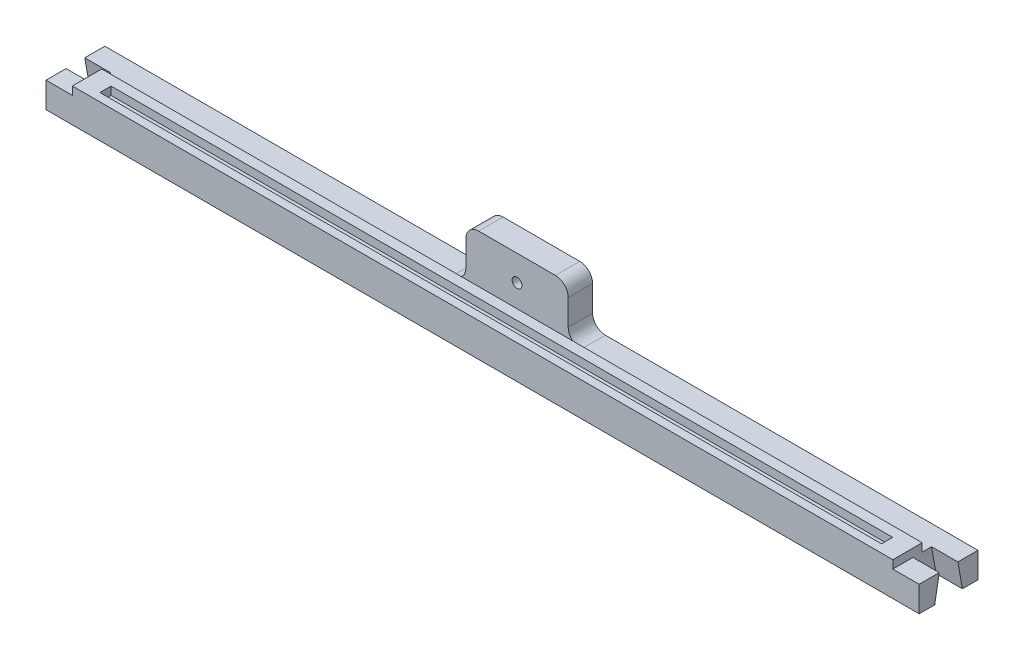
ISO-10303-21;
HEADER;
FILE_DESCRIPTION(('STEP AP214'),'2;1');
FILE_NAME('part.step','',(''),(''),'','','');
FILE_SCHEMA(('AUTOMOTIVE_DESIGN { 1 0 10303 214 1 1 1 1 }'));
ENDSEC;
DATA;
#1=APPLICATION_CONTEXT('core data for automotive mechanical design processes');
#2=APPLICATION_PROTOCOL_DEFINITION('international standard','automotive_design',2000,#1);
#3=PRODUCT_CONTEXT('',#1,'mechanical');
#4=PRODUCT('Part','Part','',(#3));
#5=PRODUCT_RELATED_PRODUCT_CATEGORY('part','',(#4));
#6=PRODUCT_DEFINITION_FORMATION('','',#4);
#7=PRODUCT_DEFINITION_CONTEXT('part definition',#1,'design');
#8=PRODUCT_DEFINITION('design','',#6,#7);
#9=PRODUCT_DEFINITION_SHAPE('','',#8);
#10=(LENGTH_UNIT() NAMED_UNIT(*) SI_UNIT(.MILLI.,.METRE.));
#11=(NAMED_UNIT(*) PLANE_ANGLE_UNIT() SI_UNIT($,.RADIAN.));
#12=(NAMED_UNIT(*) SI_UNIT($,.STERADIAN.) SOLID_ANGLE_UNIT());
#13=UNCERTAINTY_MEASURE_WITH_UNIT(LENGTH_MEASURE(1.E-05),#10,'distance_accuracy_value','');
#14=(GEOMETRIC_REPRESENTATION_CONTEXT(3) GLOBAL_UNCERTAINTY_ASSIGNED_CONTEXT((#13)) GLOBAL_UNIT_ASSIGNED_CONTEXT((#10,
#11,#12)) REPRESENTATION_CONTEXT('',''));
#15=CARTESIAN_POINT('',(0.,0.,0.));
#16=DIRECTION('',(0.,0.,1.));
#17=DIRECTION('',(1.,0.,0.));
#18=AXIS2_PLACEMENT_3D('',#15,#16,#17);
#19=CARTESIAN_POINT('',(0.,20.,0.));
#20=DIRECTION('',(0.,1.,0.));
#21=DIRECTION('',(0.,0.,1.));
#22=AXIS2_PLACEMENT_3D('',#19,#20,#21);
#23=PLANE('',#22);
#24=DIRECTION('',(1.,0.,0.));
#25=VECTOR('',#24,1.);
#26=CARTESIAN_POINT('',(0.,20.,-3.95000000000002));
#27=LINE('',#26,#25);
#28=CARTESIAN_POINT('',(-50.,20.,-3.95000000000002));
#29=VERTEX_POINT('',#28);
#30=CARTESIAN_POINT('',(50.,20.,-3.95000000000002));
#31=VERTEX_POINT('',#30);
#32=EDGE_CURVE('E50',#29,#31,#27,.T.);
#33=ORIENTED_EDGE('',*,*,#32,.F.);
#34=DIRECTION('',(0.,0.,-1.));
#35=VECTOR('',#34,1.);
#36=CARTESIAN_POINT('',(-50.,20.,-23.));
#37=LINE('',#36,#35);
#38=CARTESIAN_POINT('',(-50.,20.,-23.));
#39=VERTEX_POINT('',#38);
#40=EDGE_CURVE('E345',#29,#39,#37,.T.);
#41=ORIENTED_EDGE('',*,*,#40,.T.);
#42=DIRECTION('',(1.,0.,0.));
#43=VECTOR('',#42,1.);
#44=CARTESIAN_POINT('',(0.,20.,-23.));
#45=LINE('',#44,#43);
#46=CARTESIAN_POINT('',(-341.35,20.,-23.));
#47=VERTEX_POINT('',#46);
#48=EDGE_CURVE('E367',#47,#39,#45,.T.);
#49=ORIENTED_EDGE('',*,*,#48,.F.);
#50=DIRECTION('',(0.,0.,1.));
#51=VECTOR('',#50,1.);
#52=CARTESIAN_POINT('',(-341.35,20.,0.));
#53=LINE('',#52,#51);
#54=CARTESIAN_POINT('',(-341.35,20.,-7.291));
#55=VERTEX_POINT('',#54);
#56=EDGE_CURVE('E436',#47,#55,#53,.T.);
#57=ORIENTED_EDGE('',*,*,#56,.T.);
#58=DIRECTION('',(-1.,0.,0.));
#59=VECTOR('',#58,1.);
#60=CARTESIAN_POINT('',(0.,20.,-7.29100000000004));
#61=LINE('',#60,#59);
#62=CARTESIAN_POINT('',(-320.75,20.,-7.291));
#63=VERTEX_POINT('',#62);
#64=EDGE_CURVE('E408',#63,#55,#61,.T.);
#65=ORIENTED_EDGE('',*,*,#64,.F.);
#66=DIRECTION('',(0.,0.,1.));
#67=VECTOR('',#66,1.);
#68=CARTESIAN_POINT('',(-320.75,20.,0.));
#69=LINE('',#68,#67);
#70=CARTESIAN_POINT('',(-320.75,20.,0.));
#71=VERTEX_POINT('',#70);
#72=EDGE_CURVE('E278',#63,#71,#69,.T.);
#73=ORIENTED_EDGE('',*,*,#72,.T.);
#74=DIRECTION('',(-1.,0.,0.));
#75=VECTOR('',#74,1.);
#76=CARTESIAN_POINT('',(0.,20.,0.));
#77=LINE('',#76,#75);
#78=CARTESIAN_POINT('',(320.75,20.,0.));
#79=VERTEX_POINT('',#78);
#80=EDGE_CURVE('E254',#79,#71,#77,.T.);
#81=ORIENTED_EDGE('',*,*,#80,.F.);
#82=DIRECTION('',(0.,0.,1.));
#83=VECTOR('',#82,1.);
#84=CARTESIAN_POINT('',(320.75,20.,0.));
#85=LINE('',#84,#83);
#86=CARTESIAN_POINT('',(320.75,20.,-7.29100000000008));
#87=VERTEX_POINT('',#86);
#88=EDGE_CURVE('E244',#87,#79,#85,.T.);
#89=ORIENTED_EDGE('',*,*,#88,.F.);
#90=DIRECTION('',(1.,0.,0.));
#91=VECTOR('',#90,1.);
#92=CARTESIAN_POINT('',(0.,20.,-7.29100000000005));
#93=LINE('',#92,#91);
#94=CARTESIAN_POINT('',(341.35,20.,-7.29100000000008));
#95=VERTEX_POINT('',#94);
#96=EDGE_CURVE('E474',#87,#95,#93,.T.);
#97=ORIENTED_EDGE('',*,*,#96,.T.);
#98=DIRECTION('',(0.,0.,1.));
#99=VECTOR('',#98,1.);
#100=CARTESIAN_POINT('',(341.35,20.,0.));
#101=LINE('',#100,#99);
#102=CARTESIAN_POINT('',(341.35,20.,-23.));
#103=VERTEX_POINT('',#102);
#104=EDGE_CURVE('E366',#103,#95,#101,.T.);
#105=ORIENTED_EDGE('',*,*,#104,.F.);
#106=CARTESIAN_POINT('',(50.,20.,-23.));
#107=VERTEX_POINT('',#106);
#108=EDGE_CURVE('E355',#107,#103,#45,.T.);
#109=ORIENTED_EDGE('',*,*,#108,.F.);
#110=DIRECTION('',(0.,0.,-1.));
#111=VECTOR('',#110,1.);
#112=CARTESIAN_POINT('',(50.,20.,0.));
#113=LINE('',#112,#111);
#114=EDGE_CURVE('E343',#107,#31,#113,.F.);
#115=ORIENTED_EDGE('',*,*,#114,.T.);
#116=EDGE_LOOP('',(#33,#41,#49,#57,#65,#73,#81,#89,#97,#105,#109,#115));
#117=FACE_BOUND('',#116,.T.);
#118=ADVANCED_FACE('F35',(#117),#23,.T.);
#119=DIRECTION('',(1.,0.,0.));
#120=VECTOR('',#119,1.);
#121=CARTESIAN_POINT('',(0.,20.,23.));
#122=LINE('',#121,#120);
#123=CARTESIAN_POINT('',(-341.35,20.,23.));
#124=VERTEX_POINT('',#123);
#125=CARTESIAN_POINT('',(-320.75,20.,23.));
#126=VERTEX_POINT('',#125);
#127=EDGE_CURVE('E463',#124,#126,#122,.T.);
#128=ORIENTED_EDGE('',*,*,#127,.T.);
#129=DIRECTION('',(0.,0.,-1.));
#130=VECTOR('',#129,1.);
#131=CARTESIAN_POINT('',(-320.75,20.,0.));
#132=LINE('',#131,#130);
#133=CARTESIAN_POINT('',(-320.75,20.,7.291));
#134=VERTEX_POINT('',#133);
#135=EDGE_CURVE('E404',#126,#134,#132,.T.);
#136=ORIENTED_EDGE('',*,*,#135,.T.);
#137=DIRECTION('',(-1.,0.,0.));
#138=VECTOR('',#137,1.);
#139=CARTESIAN_POINT('',(0.,20.,7.29099999999996));
#140=LINE('',#139,#138);
#141=CARTESIAN_POINT('',(-341.35,20.,7.291));
#142=VERTEX_POINT('',#141);
#143=EDGE_CURVE('E274',#134,#142,#140,.T.);
#144=ORIENTED_EDGE('',*,*,#143,.T.);
#145=DIRECTION('',(0.,0.,1.));
#146=VECTOR('',#145,1.);
#147=CARTESIAN_POINT('',(-341.35,20.,0.));
#148=LINE('',#147,#146);
#149=EDGE_CURVE('E277',#142,#124,#148,.T.);
#150=ORIENTED_EDGE('',*,*,#149,.T.);
#151=EDGE_LOOP('',(#128,#136,#144,#150));
#152=FACE_BOUND('',#151,.T.);
#153=ADVANCED_FACE('F514',(#152),#23,.T.);
#154=DIRECTION('',(0.,0.,-1.));
#155=VECTOR('',#154,1.);
#156=CARTESIAN_POINT('',(320.75,20.,0.));
#157=LINE('',#156,#155);
#158=CARTESIAN_POINT('',(320.75,20.,23.));
#159=VERTEX_POINT('',#158);
#160=CARTESIAN_POINT('',(320.75,20.,7.29099999999992));
#161=VERTEX_POINT('',#160);
#162=EDGE_CURVE('E377',#159,#161,#157,.T.);
#163=ORIENTED_EDGE('',*,*,#162,.F.);
#164=CARTESIAN_POINT('',(341.35,20.,23.));
#165=VERTEX_POINT('',#164);
#166=EDGE_CURVE('E468',#159,#165,#122,.T.);
#167=ORIENTED_EDGE('',*,*,#166,.T.);
#168=DIRECTION('',(0.,0.,1.));
#169=VECTOR('',#168,1.);
#170=CARTESIAN_POINT('',(341.35,20.,0.));
#171=LINE('',#170,#169);
#172=CARTESIAN_POINT('',(341.35,20.,7.29099999999992));
#173=VERTEX_POINT('',#172);
#174=EDGE_CURVE('E262',#173,#165,#171,.T.);
#175=ORIENTED_EDGE('',*,*,#174,.F.);
#176=DIRECTION('',(1.,0.,0.));
#177=VECTOR('',#176,1.);
#178=CARTESIAN_POINT('',(0.,20.,7.29099999999995));
#179=LINE('',#178,#177);
#180=EDGE_CURVE('E259',#161,#173,#179,.T.);
#181=ORIENTED_EDGE('',*,*,#180,.F.);
#182=EDGE_LOOP('',(#163,#167,#175,#181));
#183=FACE_BOUND('',#182,.T.);
#184=ADVANCED_FACE('F520',(#183),#23,.T.);
#185=CARTESIAN_POINT('',(-320.75,20.,0.));
#186=DIRECTION('',(1.,0.,0.));
#187=DIRECTION('',(0.,0.,-1.));
#188=AXIS2_PLACEMENT_3D('',#185,#186,#187);
#189=PLANE('',#188);
#190=DIRECTION('',(0.,0.,1.));
#191=VECTOR('',#190,1.);
#192=CARTESIAN_POINT('',(-320.75,0.,0.));
#193=LINE('',#192,#191);
#194=CARTESIAN_POINT('',(-320.75,0.,-10.8175396141693));
#195=VERTEX_POINT('',#194);
#196=CARTESIAN_POINT('',(-320.75,0.,10.8175396141693));
#197=VERTEX_POINT('',#196);
#198=EDGE_CURVE('E427',#195,#197,#193,.T.);
#199=ORIENTED_EDGE('',*,*,#198,.T.);
#200=DIRECTION('',(0.,-0.984807753012209,0.173648177666928));
#201=VECTOR('',#200,1.);
#202=CARTESIAN_POINT('',(-320.75,21.2468344324937,7.07114944907511));
#203=LINE('',#202,#201);
#204=EDGE_CURVE('E311',#197,#134,#203,.F.);
#205=ORIENTED_EDGE('',*,*,#204,.T.);
#206=ORIENTED_EDGE('',*,*,#135,.F.);
#207=DIRECTION('',(0.,-1.,0.));
#208=VECTOR('',#207,1.);
#209=CARTESIAN_POINT('',(-320.75,26.35,23.));
#210=LINE('',#209,#208);
#211=CARTESIAN_POINT('',(-320.75,26.35,23.));
#212=VERTEX_POINT('',#211);
#213=EDGE_CURVE('E250',#212,#126,#210,.T.);
#214=ORIENTED_EDGE('',*,*,#213,.F.);
#215=DIRECTION('',(0.,0.,-1.));
#216=VECTOR('',#215,1.);
#217=CARTESIAN_POINT('',(-320.75,26.35,0.));
#218=LINE('',#217,#216);
#219=CARTESIAN_POINT('',(-320.75,26.35,0.));
#220=VERTEX_POINT('',#219);
#221=EDGE_CURVE('E228',#212,#220,#218,.T.);
#222=ORIENTED_EDGE('',*,*,#221,.T.);
#223=DIRECTION('',(0.,-1.,0.));
#224=VECTOR('',#223,1.);
#225=CARTESIAN_POINT('',(-320.75,26.35,0.));
#226=LINE('',#225,#224);
#227=EDGE_CURVE('E224',#220,#71,#226,.T.);
#228=ORIENTED_EDGE('',*,*,#227,.T.);
#229=ORIENTED_EDGE('',*,*,#72,.F.);
#230=DIRECTION('',(0.,-0.984807753012209,-0.173648177666928));
#231=VECTOR('',#230,1.);
#232=CARTESIAN_POINT('',(-320.75,21.2468344324937,-7.07114944907511));
#233=LINE('',#232,#231);
#234=EDGE_CURVE('E315',#63,#195,#233,.T.);
#235=ORIENTED_EDGE('',*,*,#234,.T.);
#236=EDGE_LOOP('',(#199,#205,#206,#214,#222,#228,#229,#235));
#237=FACE_BOUND('',#236,.T.);
#238=ADVANCED_FACE('F489',(#237),#189,.F.);
#239=CARTESIAN_POINT('',(-341.35,20.,0.));
#240=DIRECTION('',(1.,0.,0.));
#241=DIRECTION('',(0.,0.,-1.));
#242=AXIS2_PLACEMENT_3D('',#239,#240,#241);
#243=PLANE('',#242);
#244=ORIENTED_EDGE('',*,*,#149,.F.);
#245=DIRECTION('',(0.,0.984807753012209,-0.173648177666928));
#246=VECTOR('',#245,1.);
#247=CARTESIAN_POINT('',(-341.35,20.0000000000005,7.291));
#248=LINE('',#247,#246);
#249=CARTESIAN_POINT('',(-341.35,0.,10.8175396141693));
#250=VERTEX_POINT('',#249);
#251=EDGE_CURVE('E302',#142,#250,#248,.F.);
#252=ORIENTED_EDGE('',*,*,#251,.T.);
#253=DIRECTION('',(0.,0.,1.));
#254=VECTOR('',#253,1.);
#255=CARTESIAN_POINT('',(-341.35,0.,0.));
#256=LINE('',#255,#254);
#257=CARTESIAN_POINT('',(-341.35,0.,23.));
#258=VERTEX_POINT('',#257);
#259=EDGE_CURVE('E430',#250,#258,#256,.T.);
#260=ORIENTED_EDGE('',*,*,#259,.T.);
#261=DIRECTION('',(0.,-1.,0.));
#262=VECTOR('',#261,1.);
#263=CARTESIAN_POINT('',(-341.35,20.,23.));
#264=LINE('',#263,#262);
#265=EDGE_CURVE('E288',#124,#258,#264,.T.);
#266=ORIENTED_EDGE('',*,*,#265,.F.);
#267=EDGE_LOOP('',(#244,#252,#260,#266));
#268=FACE_BOUND('',#267,.T.);
#269=ADVANCED_FACE('F538',(#268),#243,.F.);
#270=CARTESIAN_POINT('',(0.,20.,23.));
#271=DIRECTION('',(0.,0.,-1.));
#272=DIRECTION('',(-1.,0.,0.));
#273=AXIS2_PLACEMENT_3D('',#270,#271,#272);
#274=PLANE('',#273);
#275=DIRECTION('',(1.,0.,0.));
#276=VECTOR('',#275,1.);
#277=CARTESIAN_POINT('',(0.,0.,23.));
#278=LINE('',#277,#276);
#279=CARTESIAN_POINT('',(341.35,0.,23.));
#280=VERTEX_POINT('',#279);
#281=EDGE_CURVE('E433',#258,#280,#278,.T.);
#282=ORIENTED_EDGE('',*,*,#281,.T.);
#283=DIRECTION('',(0.,-1.,0.));
#284=VECTOR('',#283,1.);
#285=CARTESIAN_POINT('',(341.35,20.,23.));
#286=LINE('',#285,#284);
#287=EDGE_CURVE('E457',#165,#280,#286,.T.);
#288=ORIENTED_EDGE('',*,*,#287,.F.);
#289=ORIENTED_EDGE('',*,*,#166,.F.);
#290=DIRECTION('',(0.,-1.,0.));
#291=VECTOR('',#290,1.);
#292=CARTESIAN_POINT('',(320.75,26.35,23.));
#293=LINE('',#292,#291);
#294=CARTESIAN_POINT('',(320.75,26.35,23.));
#295=VERTEX_POINT('',#294);
#296=EDGE_CURVE('E265',#295,#159,#293,.T.);
#297=ORIENTED_EDGE('',*,*,#296,.F.);
#298=DIRECTION('',(1.,0.,0.));
#299=VECTOR('',#298,1.);
#300=CARTESIAN_POINT('',(0.,26.35,23.));
#301=LINE('',#300,#299);
#302=EDGE_CURVE('E235',#212,#295,#301,.T.);
#303=ORIENTED_EDGE('',*,*,#302,.F.);
#304=ORIENTED_EDGE('',*,*,#213,.T.);
#305=ORIENTED_EDGE('',*,*,#127,.F.);
#306=ORIENTED_EDGE('',*,*,#265,.T.);
#307=EDGE_LOOP('',(#282,#288,#289,#297,#303,#304,#305,#306));
#308=FACE_BOUND('',#307,.T.);
#309=ADVANCED_FACE('F545',(#308),#274,.F.);
#310=CARTESIAN_POINT('',(341.35,20.,0.));
#311=DIRECTION('',(1.,0.,0.));
#312=DIRECTION('',(0.,0.,-1.));
#313=AXIS2_PLACEMENT_3D('',#310,#311,#312);
#314=PLANE('',#313);
#315=DIRECTION('',(0.,0.,1.));
#316=VECTOR('',#315,1.);
#317=CARTESIAN_POINT('',(341.35,0.,0.));
#318=LINE('',#317,#316);
#319=CARTESIAN_POINT('',(341.35,0.,10.8175396141692));
#320=VERTEX_POINT('',#319);
#321=EDGE_CURVE('E440',#320,#280,#318,.T.);
#322=ORIENTED_EDGE('',*,*,#321,.F.);
#323=DIRECTION('',(0.,0.984807753012209,-0.173648177666928));
#324=VECTOR('',#323,1.);
#325=CARTESIAN_POINT('',(341.35,21.2468344324937,7.07114944907504));
#326=LINE('',#325,#324);
#327=EDGE_CURVE('E300',#320,#173,#326,.T.);
#328=ORIENTED_EDGE('',*,*,#327,.T.);
#329=ORIENTED_EDGE('',*,*,#174,.T.);
#330=ORIENTED_EDGE('',*,*,#287,.T.);
#331=EDGE_LOOP('',(#322,#328,#329,#330));
#332=FACE_BOUND('',#331,.T.);
#333=ADVANCED_FACE('F550',(#332),#314,.T.);
#334=CARTESIAN_POINT('',(320.75,20.,0.));
#335=DIRECTION('',(1.,0.,0.));
#336=DIRECTION('',(0.,0.,-1.));
#337=AXIS2_PLACEMENT_3D('',#334,#335,#336);
#338=PLANE('',#337);
#339=DIRECTION('',(0.,0.,1.));
#340=VECTOR('',#339,1.);
#341=CARTESIAN_POINT('',(320.75,0.,0.));
#342=LINE('',#341,#340);
#343=CARTESIAN_POINT('',(320.75,0.,-10.8175396141694));
#344=VERTEX_POINT('',#343);
#345=CARTESIAN_POINT('',(320.75,0.,10.8175396141692));
#346=VERTEX_POINT('',#345);
#347=EDGE_CURVE('E442',#344,#346,#342,.T.);
#348=ORIENTED_EDGE('',*,*,#347,.F.);
#349=DIRECTION('',(0.,-0.984807753012209,-0.173648177666928));
#350=VECTOR('',#349,1.);
#351=CARTESIAN_POINT('',(320.75,20.0000000000005,-7.29100000000008));
#352=LINE('',#351,#350);
#353=EDGE_CURVE('E306',#344,#87,#352,.F.);
#354=ORIENTED_EDGE('',*,*,#353,.T.);
#355=ORIENTED_EDGE('',*,*,#88,.T.);
#356=DIRECTION('',(0.,-1.,0.));
#357=VECTOR('',#356,1.);
#358=CARTESIAN_POINT('',(320.75,26.35,0.));
#359=LINE('',#358,#357);
#360=CARTESIAN_POINT('',(320.75,26.35,0.));
#361=VERTEX_POINT('',#360);
#362=EDGE_CURVE('E222',#361,#79,#359,.T.);
#363=ORIENTED_EDGE('',*,*,#362,.F.);
#364=DIRECTION('',(0.,0.,-1.));
#365=VECTOR('',#364,1.);
#366=CARTESIAN_POINT('',(320.75,26.35,0.));
#367=LINE('',#366,#365);
#368=EDGE_CURVE('E229',#295,#361,#367,.T.);
#369=ORIENTED_EDGE('',*,*,#368,.F.);
#370=ORIENTED_EDGE('',*,*,#296,.T.);
#371=ORIENTED_EDGE('',*,*,#162,.T.);
#372=DIRECTION('',(0.,-0.984807753012209,0.173648177666928));
#373=VECTOR('',#372,1.);
#374=CARTESIAN_POINT('',(320.75,0.,10.8175396141692));
#375=LINE('',#374,#373);
#376=EDGE_CURVE('E308',#161,#346,#375,.T.);
#377=ORIENTED_EDGE('',*,*,#376,.T.);
#378=EDGE_LOOP('',(#348,#354,#355,#363,#369,#370,#371,#377));
#379=FACE_BOUND('',#378,.T.);
#380=ADVANCED_FACE('F242',(#379),#338,.T.);
#381=CARTESIAN_POINT('',(341.35,20.,0.));
#382=DIRECTION('',(1.,0.,0.));
#383=DIRECTION('',(0.,0.,-1.));
#384=AXIS2_PLACEMENT_3D('',#381,#382,#383);
#385=PLANE('',#384);
#386=ORIENTED_EDGE('',*,*,#104,.T.);
#387=DIRECTION('',(0.,0.984807753012209,0.173648177666928));
#388=VECTOR('',#387,1.);
#389=CARTESIAN_POINT('',(341.35,21.2468344324937,-7.07114944907519));
#390=LINE('',#389,#388);
#391=CARTESIAN_POINT('',(341.35,0.,-10.8175396141694));
#392=VERTEX_POINT('',#391);
#393=EDGE_CURVE('E285',#95,#392,#390,.F.);
#394=ORIENTED_EDGE('',*,*,#393,.T.);
#395=DIRECTION('',(0.,0.,1.));
#396=VECTOR('',#395,1.);
#397=CARTESIAN_POINT('',(341.35,0.,0.));
#398=LINE('',#397,#396);
#399=CARTESIAN_POINT('',(341.35,0.,-23.));
#400=VERTEX_POINT('',#399);
#401=EDGE_CURVE('E444',#400,#392,#398,.T.);
#402=ORIENTED_EDGE('',*,*,#401,.F.);
#403=DIRECTION('',(0.,-1.,0.));
#404=VECTOR('',#403,1.);
#405=CARTESIAN_POINT('',(341.35,20.,-23.));
#406=LINE('',#405,#404);
#407=EDGE_CURVE('E455',#103,#400,#406,.T.);
#408=ORIENTED_EDGE('',*,*,#407,.F.);
#409=EDGE_LOOP('',(#386,#394,#402,#408));
#410=FACE_BOUND('',#409,.T.);
#411=ADVANCED_FACE('F497',(#410),#385,.T.);
#412=CARTESIAN_POINT('',(0.,20.,-23.));
#413=DIRECTION('',(0.,0.,-1.));
#414=DIRECTION('',(-1.,0.,0.));
#415=AXIS2_PLACEMENT_3D('',#412,#413,#414);
#416=PLANE('',#415);
#417=CARTESIAN_POINT('',(0.,40.,-23.));
#418=DIRECTION('',(0.,0.,-1.));
#419=DIRECTION('',(-1.,0.,0.));
#420=AXIS2_PLACEMENT_3D('',#417,#418,#419);
#421=CIRCLE('',#420,3.81);
#422=CARTESIAN_POINT('',(-3.81000000000001,40.,-23.));
#423=VERTEX_POINT('',#422);
#424=EDGE_CURVE('E284',#423,#423,#421,.T.);
#425=ORIENTED_EDGE('',*,*,#424,.F.);
#426=EDGE_LOOP('',(#425));
#427=FACE_BOUND('',#426,.T.);
#428=DIRECTION('',(-1.,0.,0.));
#429=VECTOR('',#428,1.);
#430=CARTESIAN_POINT('',(0.,60.,-23.));
#431=LINE('',#430,#429);
#432=CARTESIAN_POINT('',(30.,60.,-23.));
#433=VERTEX_POINT('',#432);
#434=CARTESIAN_POINT('',(-30.,60.,-23.));
#435=VERTEX_POINT('',#434);
#436=EDGE_CURVE('E600',#433,#435,#431,.T.);
#437=ORIENTED_EDGE('',*,*,#436,.F.);
#438=CARTESIAN_POINT('',(30.,50.,-23.));
#439=DIRECTION('',(0.,0.,-1.));
#440=DIRECTION('',(-1.,0.,0.));
#441=AXIS2_PLACEMENT_3D('',#438,#439,#440);
#442=CIRCLE('',#441,10.);
#443=CARTESIAN_POINT('',(40.,50.,-23.));
#444=VERTEX_POINT('',#443);
#445=EDGE_CURVE('E327',#433,#444,#442,.T.);
#446=ORIENTED_EDGE('',*,*,#445,.T.);
#447=DIRECTION('',(0.,-1.,0.));
#448=VECTOR('',#447,1.);
#449=CARTESIAN_POINT('',(40.,60.,-23.));
#450=LINE('',#449,#448);
#451=CARTESIAN_POINT('',(40.,30.,-23.));
#452=VERTEX_POINT('',#451);
#453=EDGE_CURVE('E358',#444,#452,#450,.T.);
#454=ORIENTED_EDGE('',*,*,#453,.T.);
#455=CARTESIAN_POINT('',(50.,30.,-23.));
#456=DIRECTION('',(0.,0.,-1.));
#457=DIRECTION('',(-1.,0.,0.));
#458=AXIS2_PLACEMENT_3D('',#455,#456,#457);
#459=CIRCLE('',#458,10.);
#460=EDGE_CURVE('E43',#452,#107,#459,.F.);
#461=ORIENTED_EDGE('',*,*,#460,.T.);
#462=ORIENTED_EDGE('',*,*,#108,.T.);
#463=ORIENTED_EDGE('',*,*,#407,.T.);
#464=DIRECTION('',(1.,0.,0.));
#465=VECTOR('',#464,1.);
#466=CARTESIAN_POINT('',(0.,0.,-23.));
#467=LINE('',#466,#465);
#468=CARTESIAN_POINT('',(-341.35,0.,-23.));
#469=VERTEX_POINT('',#468);
#470=EDGE_CURVE('E447',#469,#400,#467,.T.);
#471=ORIENTED_EDGE('',*,*,#470,.F.);
#472=DIRECTION('',(0.,-1.,0.));
#473=VECTOR('',#472,1.);
#474=CARTESIAN_POINT('',(-341.35,20.,-23.));
#475=LINE('',#474,#473);
#476=EDGE_CURVE('E453',#47,#469,#475,.T.);
#477=ORIENTED_EDGE('',*,*,#476,.F.);
#478=ORIENTED_EDGE('',*,*,#48,.T.);
#479=CARTESIAN_POINT('',(-50.,30.,-23.));
#480=DIRECTION('',(0.,0.,-1.));
#481=DIRECTION('',(-1.,0.,0.));
#482=AXIS2_PLACEMENT_3D('',#479,#480,#481);
#483=CIRCLE('',#482,10.);
#484=CARTESIAN_POINT('',(-40.,30.,-23.));
#485=VERTEX_POINT('',#484);
#486=EDGE_CURVE('E347',#39,#485,#483,.F.);
#487=ORIENTED_EDGE('',*,*,#486,.T.);
#488=DIRECTION('',(0.,-1.,0.));
#489=VECTOR('',#488,1.);
#490=CARTESIAN_POINT('',(-40.,60.,-23.));
#491=LINE('',#490,#489);
#492=CARTESIAN_POINT('',(-40.,50.,-23.));
#493=VERTEX_POINT('',#492);
#494=EDGE_CURVE('E381',#493,#485,#491,.T.);
#495=ORIENTED_EDGE('',*,*,#494,.F.);
#496=CARTESIAN_POINT('',(-30.,50.,-23.));
#497=DIRECTION('',(0.,0.,-1.));
#498=DIRECTION('',(-1.,0.,0.));
#499=AXIS2_PLACEMENT_3D('',#496,#497,#498);
#500=CIRCLE('',#499,10.);
#501=EDGE_CURVE('E325',#493,#435,#500,.T.);
#502=ORIENTED_EDGE('',*,*,#501,.T.);
#503=EDGE_LOOP('',(#437,#446,#454,#461,#462,#463,#471,#477,#478,#487,#495,#502));
#504=FACE_BOUND('',#503,.T.);
#505=ADVANCED_FACE('F354',(#427,#504),#416,.T.);
#506=CARTESIAN_POINT('',(-341.35,20.,0.));
#507=DIRECTION('',(1.,0.,0.));
#508=DIRECTION('',(0.,0.,-1.));
#509=AXIS2_PLACEMENT_3D('',#506,#507,#508);
#510=PLANE('',#509);
#511=DIRECTION('',(0.,0.,1.));
#512=VECTOR('',#511,1.);
#513=CARTESIAN_POINT('',(-341.35,0.,0.));
#514=LINE('',#513,#512);
#515=CARTESIAN_POINT('',(-341.35,0.,-10.8175396141693));
#516=VERTEX_POINT('',#515);
#517=EDGE_CURVE('E450',#469,#516,#514,.T.);
#518=ORIENTED_EDGE('',*,*,#517,.T.);
#519=DIRECTION('',(0.,0.984807753012209,0.173648177666928));
#520=VECTOR('',#519,1.);
#521=CARTESIAN_POINT('',(-341.35,0.,-10.8175396141693));
#522=LINE('',#521,#520);
#523=EDGE_CURVE('E304',#516,#55,#522,.T.);
#524=ORIENTED_EDGE('',*,*,#523,.T.);
#525=ORIENTED_EDGE('',*,*,#56,.F.);
#526=ORIENTED_EDGE('',*,*,#476,.T.);
#527=EDGE_LOOP('',(#518,#524,#525,#526));
#528=FACE_BOUND('',#527,.T.);
#529=ADVANCED_FACE('F502',(#528),#510,.F.);
#530=CARTESIAN_POINT('',(0.,0.,0.));
#531=DIRECTION('',(0.,1.,0.));
#532=DIRECTION('',(0.,0.,1.));
#533=AXIS2_PLACEMENT_3D('',#530,#531,#532);
#534=PLANE('',#533);
#535=ORIENTED_EDGE('',*,*,#401,.T.);
#536=DIRECTION('',(-1.,0.,0.));
#537=VECTOR('',#536,1.);
#538=CARTESIAN_POINT('',(0.,0.,-10.8175396141694));
#539=LINE('',#538,#537);
#540=EDGE_CURVE('E297',#392,#344,#539,.T.);
#541=ORIENTED_EDGE('',*,*,#540,.T.);
#542=ORIENTED_EDGE('',*,*,#347,.T.);
#543=DIRECTION('',(1.,0.,0.));
#544=VECTOR('',#543,1.);
#545=CARTESIAN_POINT('',(341.35,0.,10.8175396141692));
#546=LINE('',#545,#544);
#547=EDGE_CURVE('E294',#346,#320,#546,.T.);
#548=ORIENTED_EDGE('',*,*,#547,.T.);
#549=ORIENTED_EDGE('',*,*,#321,.T.);
#550=ORIENTED_EDGE('',*,*,#281,.F.);
#551=ORIENTED_EDGE('',*,*,#259,.F.);
#552=DIRECTION('',(1.,0.,0.));
#553=VECTOR('',#552,1.);
#554=CARTESIAN_POINT('',(0.,0.,10.8175396141693));
#555=LINE('',#554,#553);
#556=EDGE_CURVE('E291',#250,#197,#555,.T.);
#557=ORIENTED_EDGE('',*,*,#556,.T.);
#558=ORIENTED_EDGE('',*,*,#198,.F.);
#559=DIRECTION('',(-1.,0.,0.));
#560=VECTOR('',#559,1.);
#561=CARTESIAN_POINT('',(-341.35,0.,-10.8175396141693));
#562=LINE('',#561,#560);
#563=EDGE_CURVE('E287',#195,#516,#562,.T.);
#564=ORIENTED_EDGE('',*,*,#563,.T.);
#565=ORIENTED_EDGE('',*,*,#517,.F.);
#566=ORIENTED_EDGE('',*,*,#470,.T.);
#567=EDGE_LOOP('',(#535,#541,#542,#548,#549,#550,#551,#557,#558,#564,#565,#566));
#568=FACE_BOUND('',#567,.T.);
#569=ADVANCED_FACE('F499',(#568),#534,.F.);
#570=CARTESIAN_POINT('',(0.,26.35,7.91875));
#571=DIRECTION('',(0.,0.,-1.));
#572=DIRECTION('',(-1.,0.,0.));
#573=AXIS2_PLACEMENT_3D('',#570,#571,#572);
#574=PLANE('',#573);
#575=DIRECTION('',(1.,0.,0.));
#576=VECTOR('',#575,1.);
#577=CARTESIAN_POINT('',(0.,20.,7.91875));
#578=LINE('',#577,#576);
#579=CARTESIAN_POINT('',(-305.55,20.,7.91875));
#580=VERTEX_POINT('',#579);
#581=CARTESIAN_POINT('',(305.55,20.,7.91875));
#582=VERTEX_POINT('',#581);
#583=EDGE_CURVE('E407',#580,#582,#578,.T.);
#584=ORIENTED_EDGE('',*,*,#583,.T.);
#585=DIRECTION('',(0.,-1.,0.));
#586=VECTOR('',#585,1.);
#587=CARTESIAN_POINT('',(305.55,26.35,7.91875));
#588=LINE('',#587,#586);
#589=CARTESIAN_POINT('',(305.55,26.35,7.91875));
#590=VERTEX_POINT('',#589);
#591=EDGE_CURVE('E402',#590,#582,#588,.T.);
#592=ORIENTED_EDGE('',*,*,#591,.F.);
#593=DIRECTION('',(1.,0.,0.));
#594=VECTOR('',#593,1.);
#595=CARTESIAN_POINT('',(0.,26.35,7.91875));
#596=LINE('',#595,#594);
#597=CARTESIAN_POINT('',(-305.55,26.35,7.91875));
#598=VERTEX_POINT('',#597);
#599=EDGE_CURVE('E387',#598,#590,#596,.T.);
#600=ORIENTED_EDGE('',*,*,#599,.F.);
#601=DIRECTION('',(0.,-1.,0.));
#602=VECTOR('',#601,1.);
#603=CARTESIAN_POINT('',(-305.55,26.35,7.91875));
#604=LINE('',#603,#602);
#605=EDGE_CURVE('E245',#598,#580,#604,.T.);
#606=ORIENTED_EDGE('',*,*,#605,.T.);
#607=EDGE_LOOP('',(#584,#592,#600,#606));
#608=FACE_BOUND('',#607,.T.);
#609=ADVANCED_FACE('F509',(#608),#574,.F.);
#610=CARTESIAN_POINT('',(305.55,26.35,0.));
#611=DIRECTION('',(1.,0.,0.));
#612=DIRECTION('',(0.,0.,-1.));
#613=AXIS2_PLACEMENT_3D('',#610,#611,#612);
#614=PLANE('',#613);
#615=DIRECTION('',(0.,0.,1.));
#616=VECTOR('',#615,1.);
#617=CARTESIAN_POINT('',(305.55,20.,0.));
#618=LINE('',#617,#616);
#619=CARTESIAN_POINT('',(305.55,20.,16.65));
#620=VERTEX_POINT('',#619);
#621=EDGE_CURVE('E414',#582,#620,#618,.T.);
#622=ORIENTED_EDGE('',*,*,#621,.T.);
#623=DIRECTION('',(0.,-1.,0.));
#624=VECTOR('',#623,1.);
#625=CARTESIAN_POINT('',(305.55,26.35,16.65));
#626=LINE('',#625,#624);
#627=CARTESIAN_POINT('',(305.55,26.35,16.65));
#628=VERTEX_POINT('',#627);
#629=EDGE_CURVE('E421',#628,#620,#626,.T.);
#630=ORIENTED_EDGE('',*,*,#629,.F.);
#631=DIRECTION('',(0.,0.,1.));
#632=VECTOR('',#631,1.);
#633=CARTESIAN_POINT('',(305.55,26.35,0.));
#634=LINE('',#633,#632);
#635=EDGE_CURVE('E390',#590,#628,#634,.T.);
#636=ORIENTED_EDGE('',*,*,#635,.F.);
#637=ORIENTED_EDGE('',*,*,#591,.T.);
#638=EDGE_LOOP('',(#622,#630,#636,#637));
#639=FACE_BOUND('',#638,.T.);
#640=ADVANCED_FACE('F635',(#639),#614,.F.);
#641=CARTESIAN_POINT('',(0.,26.35,16.65));
#642=DIRECTION('',(0.,0.,-1.));
#643=DIRECTION('',(-1.,0.,0.));
#644=AXIS2_PLACEMENT_3D('',#641,#642,#643);
#645=PLANE('',#644);
#646=DIRECTION('',(1.,0.,0.));
#647=VECTOR('',#646,1.);
#648=CARTESIAN_POINT('',(0.,20.,16.65));
#649=LINE('',#648,#647);
#650=CARTESIAN_POINT('',(-305.55,20.,16.65));
#651=VERTEX_POINT('',#650);
#652=EDGE_CURVE('E417',#651,#620,#649,.T.);
#653=ORIENTED_EDGE('',*,*,#652,.F.);
#654=DIRECTION('',(0.,-1.,0.));
#655=VECTOR('',#654,1.);
#656=CARTESIAN_POINT('',(-305.55,26.35,16.65));
#657=LINE('',#656,#655);
#658=CARTESIAN_POINT('',(-305.55,26.35,16.65));
#659=VERTEX_POINT('',#658);
#660=EDGE_CURVE('E248',#659,#651,#657,.T.);
#661=ORIENTED_EDGE('',*,*,#660,.F.);
#662=DIRECTION('',(1.,0.,0.));
#663=VECTOR('',#662,1.);
#664=CARTESIAN_POINT('',(0.,26.35,16.65));
#665=LINE('',#664,#663);
#666=EDGE_CURVE('E392',#659,#628,#665,.T.);
#667=ORIENTED_EDGE('',*,*,#666,.T.);
#668=ORIENTED_EDGE('',*,*,#629,.T.);
#669=EDGE_LOOP('',(#653,#661,#667,#668));
#670=FACE_BOUND('',#669,.T.);
#671=ADVANCED_FACE('F632',(#670),#645,.T.);
#672=CARTESIAN_POINT('',(0.,26.35,0.));
#673=DIRECTION('',(0.,0.,1.));
#674=DIRECTION('',(1.,0.,0.));
#675=AXIS2_PLACEMENT_3D('',#672,#673,#674);
#676=PLANE('',#675);
#677=ORIENTED_EDGE('',*,*,#80,.T.);
#678=ORIENTED_EDGE('',*,*,#227,.F.);
#679=DIRECTION('',(-1.,0.,0.));
#680=VECTOR('',#679,1.);
#681=CARTESIAN_POINT('',(0.,26.35,0.));
#682=LINE('',#681,#680);
#683=EDGE_CURVE('E217',#361,#220,#682,.T.);
#684=ORIENTED_EDGE('',*,*,#683,.F.);
#685=ORIENTED_EDGE('',*,*,#362,.T.);
#686=EDGE_LOOP('',(#677,#678,#684,#685));
#687=FACE_BOUND('',#686,.T.);
#688=ADVANCED_FACE('F220',(#687),#676,.F.);
#689=CARTESIAN_POINT('',(-305.55,26.35,0.));
#690=DIRECTION('',(1.,0.,0.));
#691=DIRECTION('',(0.,0.,-1.));
#692=AXIS2_PLACEMENT_3D('',#689,#690,#691);
#693=PLANE('',#692);
#694=DIRECTION('',(0.,0.,1.));
#695=VECTOR('',#694,1.);
#696=CARTESIAN_POINT('',(-305.55,20.,0.));
#697=LINE('',#696,#695);
#698=EDGE_CURVE('E239',#580,#651,#697,.T.);
#699=ORIENTED_EDGE('',*,*,#698,.F.);
#700=ORIENTED_EDGE('',*,*,#605,.F.);
#701=DIRECTION('',(0.,0.,1.));
#702=VECTOR('',#701,1.);
#703=CARTESIAN_POINT('',(-305.55,26.35,0.));
#704=LINE('',#703,#702);
#705=EDGE_CURVE('E267',#598,#659,#704,.T.);
#706=ORIENTED_EDGE('',*,*,#705,.T.);
#707=ORIENTED_EDGE('',*,*,#660,.T.);
#708=EDGE_LOOP('',(#699,#700,#706,#707));
#709=FACE_BOUND('',#708,.T.);
#710=ADVANCED_FACE('F531',(#709),#693,.T.);
#711=CARTESIAN_POINT('',(0.,26.35,0.));
#712=DIRECTION('',(0.,1.,0.));
#713=DIRECTION('',(0.,0.,1.));
#714=AXIS2_PLACEMENT_3D('',#711,#712,#713);
#715=PLANE('',#714);
#716=ORIENTED_EDGE('',*,*,#368,.T.);
#717=ORIENTED_EDGE('',*,*,#683,.T.);
#718=ORIENTED_EDGE('',*,*,#221,.F.);
#719=ORIENTED_EDGE('',*,*,#302,.T.);
#720=EDGE_LOOP('',(#716,#717,#718,#719));
#721=FACE_BOUND('',#720,.T.);
#722=ORIENTED_EDGE('',*,*,#599,.T.);
#723=ORIENTED_EDGE('',*,*,#635,.T.);
#724=ORIENTED_EDGE('',*,*,#666,.F.);
#725=ORIENTED_EDGE('',*,*,#705,.F.);
#726=EDGE_LOOP('',(#722,#723,#724,#725));
#727=FACE_BOUND('',#726,.T.);
#728=ADVANCED_FACE('F232',(#721,#727),#715,.T.);
#729=ORIENTED_EDGE('',*,*,#583,.F.);
#730=ORIENTED_EDGE('',*,*,#698,.T.);
#731=ORIENTED_EDGE('',*,*,#652,.T.);
#732=ORIENTED_EDGE('',*,*,#621,.F.);
#733=EDGE_LOOP('',(#729,#730,#731,#732));
#734=FACE_BOUND('',#733,.T.);
#735=ADVANCED_FACE('F516',(#734),#23,.T.);
#736=CARTESIAN_POINT('',(0.,60.,-3.95000000000002));
#737=DIRECTION('',(0.,0.,-1.));
#738=DIRECTION('',(-1.,0.,0.));
#739=AXIS2_PLACEMENT_3D('',#736,#737,#738);
#740=PLANE('',#739);
#741=CARTESIAN_POINT('',(0.,40.,-3.95000000000002));
#742=DIRECTION('',(0.,0.,-1.));
#743=DIRECTION('',(-1.,0.,0.));
#744=AXIS2_PLACEMENT_3D('',#741,#742,#743);
#745=CIRCLE('',#744,3.81);
#746=CARTESIAN_POINT('',(-3.81000000000001,40.,-3.95000000000002));
#747=VERTEX_POINT('',#746);
#748=EDGE_CURVE('E281',#747,#747,#745,.T.);
#749=ORIENTED_EDGE('',*,*,#748,.T.);
#750=EDGE_LOOP('',(#749));
#751=FACE_BOUND('',#750,.T.);
#752=DIRECTION('',(0.,-1.,0.));
#753=VECTOR('',#752,1.);
#754=CARTESIAN_POINT('',(40.,60.,-3.95000000000002));
#755=LINE('',#754,#753);
#756=CARTESIAN_POINT('',(40.,50.,-3.95000000000002));
#757=VERTEX_POINT('',#756);
#758=CARTESIAN_POINT('',(40.,30.,-3.95000000000002));
#759=VERTEX_POINT('',#758);
#760=EDGE_CURVE('E372',#757,#759,#755,.T.);
#761=ORIENTED_EDGE('',*,*,#760,.F.);
#762=CARTESIAN_POINT('',(30.,50.,-3.95000000000002));
#763=DIRECTION('',(0.,0.,-1.));
#764=DIRECTION('',(-1.,0.,0.));
#765=AXIS2_PLACEMENT_3D('',#762,#763,#764);
#766=CIRCLE('',#765,10.);
#767=CARTESIAN_POINT('',(30.,60.,-3.95000000000002));
#768=VERTEX_POINT('',#767);
#769=EDGE_CURVE('E336',#757,#768,#766,.F.);
#770=ORIENTED_EDGE('',*,*,#769,.T.);
#771=DIRECTION('',(1.,0.,0.));
#772=VECTOR('',#771,1.);
#773=CARTESIAN_POINT('',(0.,60.,-3.95000000000002));
#774=LINE('',#773,#772);
#775=CARTESIAN_POINT('',(-30.,60.,-3.95000000000002));
#776=VERTEX_POINT('',#775);
#777=EDGE_CURVE('E604',#776,#768,#774,.T.);
#778=ORIENTED_EDGE('',*,*,#777,.F.);
#779=CARTESIAN_POINT('',(-30.,50.,-3.95000000000002));
#780=DIRECTION('',(0.,0.,-1.));
#781=DIRECTION('',(-1.,0.,0.));
#782=AXIS2_PLACEMENT_3D('',#779,#780,#781);
#783=CIRCLE('',#782,10.);
#784=CARTESIAN_POINT('',(-40.,50.,-3.95000000000002));
#785=VERTEX_POINT('',#784);
#786=EDGE_CURVE('E334',#776,#785,#783,.F.);
#787=ORIENTED_EDGE('',*,*,#786,.T.);
#788=DIRECTION('',(0.,-1.,0.));
#789=VECTOR('',#788,1.);
#790=CARTESIAN_POINT('',(-40.,60.,-3.95000000000002));
#791=LINE('',#790,#789);
#792=CARTESIAN_POINT('',(-40.,30.,-3.95000000000002));
#793=VERTEX_POINT('',#792);
#794=EDGE_CURVE('E595',#785,#793,#791,.T.);
#795=ORIENTED_EDGE('',*,*,#794,.T.);
#796=CARTESIAN_POINT('',(-50.,30.,-3.95000000000002));
#797=DIRECTION('',(0.,0.,-1.));
#798=DIRECTION('',(-1.,0.,0.));
#799=AXIS2_PLACEMENT_3D('',#796,#797,#798);
#800=CIRCLE('',#799,10.);
#801=EDGE_CURVE('E349',#793,#29,#800,.T.);
#802=ORIENTED_EDGE('',*,*,#801,.T.);
#803=ORIENTED_EDGE('',*,*,#32,.T.);
#804=CARTESIAN_POINT('',(50.,30.,-3.95000000000002));
#805=DIRECTION('',(0.,0.,-1.));
#806=DIRECTION('',(-1.,0.,0.));
#807=AXIS2_PLACEMENT_3D('',#804,#805,#806);
#808=CIRCLE('',#807,10.);
#809=EDGE_CURVE('E11',#31,#759,#808,.T.);
#810=ORIENTED_EDGE('',*,*,#809,.T.);
#811=EDGE_LOOP('',(#761,#770,#778,#787,#795,#802,#803,#810));
#812=FACE_BOUND('',#811,.T.);
#813=ADVANCED_FACE('F371',(#751,#812),#740,.F.);
#814=CARTESIAN_POINT('',(40.,60.,0.));
#815=DIRECTION('',(-1.,0.,0.));
#816=DIRECTION('',(0.,0.,1.));
#817=AXIS2_PLACEMENT_3D('',#814,#815,#816);
#818=PLANE('',#817);
#819=ORIENTED_EDGE('',*,*,#453,.F.);
#820=DIRECTION('',(0.,0.,-1.));
#821=VECTOR('',#820,1.);
#822=CARTESIAN_POINT('',(40.,50.,-3.95000000000002));
#823=LINE('',#822,#821);
#824=EDGE_CURVE('E332',#444,#757,#823,.F.);
#825=ORIENTED_EDGE('',*,*,#824,.T.);
#826=ORIENTED_EDGE('',*,*,#760,.T.);
#827=DIRECTION('',(0.,0.,-1.));
#828=VECTOR('',#827,1.);
#829=CARTESIAN_POINT('',(40.,30.,0.));
#830=LINE('',#829,#828);
#831=EDGE_CURVE('E329',#759,#452,#830,.T.);
#832=ORIENTED_EDGE('',*,*,#831,.T.);
#833=EDGE_LOOP('',(#819,#825,#826,#832));
#834=FACE_BOUND('',#833,.T.);
#835=ADVANCED_FACE('F375',(#834),#818,.F.);
#836=CARTESIAN_POINT('',(-40.,60.,0.));
#837=DIRECTION('',(-1.,0.,0.));
#838=DIRECTION('',(0.,0.,1.));
#839=AXIS2_PLACEMENT_3D('',#836,#837,#838);
#840=PLANE('',#839);
#841=ORIENTED_EDGE('',*,*,#794,.F.);
#842=DIRECTION('',(0.,0.,-1.));
#843=VECTOR('',#842,1.);
#844=CARTESIAN_POINT('',(-40.,50.,0.));
#845=LINE('',#844,#843);
#846=EDGE_CURVE('E340',#785,#493,#845,.T.);
#847=ORIENTED_EDGE('',*,*,#846,.T.);
#848=ORIENTED_EDGE('',*,*,#494,.T.);
#849=DIRECTION('',(0.,0.,-1.));
#850=VECTOR('',#849,1.);
#851=CARTESIAN_POINT('',(-40.,30.,-3.95000000000002));
#852=LINE('',#851,#850);
#853=EDGE_CURVE('E338',#485,#793,#852,.F.);
#854=ORIENTED_EDGE('',*,*,#853,.T.);
#855=EDGE_LOOP('',(#841,#847,#848,#854));
#856=FACE_BOUND('',#855,.T.);
#857=ADVANCED_FACE('F621',(#856),#840,.T.);
#858=CARTESIAN_POINT('',(0.,60.,0.));
#859=DIRECTION('',(0.,1.,0.));
#860=DIRECTION('',(0.,0.,1.));
#861=AXIS2_PLACEMENT_3D('',#858,#859,#860);
#862=PLANE('',#861);
#863=ORIENTED_EDGE('',*,*,#777,.T.);
#864=DIRECTION('',(0.,0.,-1.));
#865=VECTOR('',#864,1.);
#866=CARTESIAN_POINT('',(30.,60.,-23.));
#867=LINE('',#866,#865);
#868=EDGE_CURVE('E322',#768,#433,#867,.T.);
#869=ORIENTED_EDGE('',*,*,#868,.T.);
#870=ORIENTED_EDGE('',*,*,#436,.T.);
#871=DIRECTION('',(0.,0.,-1.));
#872=VECTOR('',#871,1.);
#873=CARTESIAN_POINT('',(-30.,60.,0.));
#874=LINE('',#873,#872);
#875=EDGE_CURVE('E320',#435,#776,#874,.F.);
#876=ORIENTED_EDGE('',*,*,#875,.T.);
#877=EDGE_LOOP('',(#863,#869,#870,#876));
#878=FACE_BOUND('',#877,.T.);
#879=ADVANCED_FACE('F615',(#878),#862,.T.);
#880=CARTESIAN_POINT('',(0.,40.,27.8));
#881=DIRECTION('',(0.,0.,-1.));
#882=DIRECTION('',(-1.,0.,0.));
#883=AXIS2_PLACEMENT_3D('',#880,#881,#882);
#884=CYLINDRICAL_SURFACE('',#883,3.81);
#885=ORIENTED_EDGE('',*,*,#424,.T.);
#886=EDGE_LOOP('',(#885));
#887=FACE_BOUND('',#886,.T.);
#888=ORIENTED_EDGE('',*,*,#748,.F.);
#889=EDGE_LOOP('',(#888));
#890=FACE_BOUND('',#889,.T.);
#891=ADVANCED_FACE('F572',(#887,#890),#884,.F.);
#892=CARTESIAN_POINT('',(0.,20.0000000000005,-7.29100000000005));
#893=DIRECTION('',(0.,0.173648177666928,-0.984807753012209));
#894=DIRECTION('',(1.,0.,0.));
#895=AXIS2_PLACEMENT_3D('',#892,#893,#894);
#896=PLANE('',#895);
#897=ORIENTED_EDGE('',*,*,#353,.F.);
#898=ORIENTED_EDGE('',*,*,#540,.F.);
#899=ORIENTED_EDGE('',*,*,#393,.F.);
#900=ORIENTED_EDGE('',*,*,#96,.F.);
#901=EDGE_LOOP('',(#897,#898,#899,#900));
#902=FACE_BOUND('',#901,.T.);
#903=ADVANCED_FACE('F493',(#902),#896,.F.);
#904=CARTESIAN_POINT('',(0.,0.,10.8175396141693));
#905=DIRECTION('',(0.,-0.173648177666928,-0.984807753012209));
#906=DIRECTION('',(-1.,0.,0.));
#907=AXIS2_PLACEMENT_3D('',#904,#905,#906);
#908=PLANE('',#907);
#909=ORIENTED_EDGE('',*,*,#376,.F.);
#910=ORIENTED_EDGE('',*,*,#180,.T.);
#911=ORIENTED_EDGE('',*,*,#327,.F.);
#912=ORIENTED_EDGE('',*,*,#547,.F.);
#913=EDGE_LOOP('',(#909,#910,#911,#912));
#914=FACE_BOUND('',#913,.T.);
#915=ADVANCED_FACE('F564',(#914),#908,.T.);
#916=CARTESIAN_POINT('',(0.,20.0000000000005,7.29099999999996));
#917=DIRECTION('',(0.,0.173648177666928,0.984807753012209));
#918=DIRECTION('',(-1.,0.,0.));
#919=AXIS2_PLACEMENT_3D('',#916,#917,#918);
#920=PLANE('',#919);
#921=ORIENTED_EDGE('',*,*,#204,.F.);
#922=ORIENTED_EDGE('',*,*,#556,.F.);
#923=ORIENTED_EDGE('',*,*,#251,.F.);
#924=ORIENTED_EDGE('',*,*,#143,.F.);
#925=EDGE_LOOP('',(#921,#922,#923,#924));
#926=FACE_BOUND('',#925,.T.);
#927=ADVANCED_FACE('F559',(#926),#920,.F.);
#928=CARTESIAN_POINT('',(0.,0.,-10.8175396141694));
#929=DIRECTION('',(0.,-0.173648177666928,0.984807753012209));
#930=DIRECTION('',(1.,0.,0.));
#931=AXIS2_PLACEMENT_3D('',#928,#929,#930);
#932=PLANE('',#931);
#933=ORIENTED_EDGE('',*,*,#234,.F.);
#934=ORIENTED_EDGE('',*,*,#64,.T.);
#935=ORIENTED_EDGE('',*,*,#523,.F.);
#936=ORIENTED_EDGE('',*,*,#563,.F.);
#937=EDGE_LOOP('',(#933,#934,#935,#936));
#938=FACE_BOUND('',#937,.T.);
#939=ADVANCED_FACE('F487',(#938),#932,.T.);
#940=CARTESIAN_POINT('',(30.,50.,0.));
#941=DIRECTION('',(0.,0.,1.));
#942=DIRECTION('',(1.,0.,0.));
#943=AXIS2_PLACEMENT_3D('',#940,#941,#942);
#944=CYLINDRICAL_SURFACE('',#943,10.);
#945=ORIENTED_EDGE('',*,*,#769,.F.);
#946=ORIENTED_EDGE('',*,*,#824,.F.);
#947=ORIENTED_EDGE('',*,*,#445,.F.);
#948=ORIENTED_EDGE('',*,*,#868,.F.);
#949=EDGE_LOOP('',(#945,#946,#947,#948));
#950=FACE_BOUND('',#949,.T.);
#951=ADVANCED_FACE('F577',(#950),#944,.T.);
#952=CARTESIAN_POINT('',(-30.,50.,0.));
#953=DIRECTION('',(0.,0.,-1.));
#954=DIRECTION('',(-1.,0.,0.));
#955=AXIS2_PLACEMENT_3D('',#952,#953,#954);
#956=CYLINDRICAL_SURFACE('',#955,10.);
#957=ORIENTED_EDGE('',*,*,#786,.F.);
#958=ORIENTED_EDGE('',*,*,#875,.F.);
#959=ORIENTED_EDGE('',*,*,#501,.F.);
#960=ORIENTED_EDGE('',*,*,#846,.F.);
#961=EDGE_LOOP('',(#957,#958,#959,#960));
#962=FACE_BOUND('',#961,.T.);
#963=ADVANCED_FACE('F580',(#962),#956,.T.);
#964=CARTESIAN_POINT('',(-50.,30.,0.));
#965=DIRECTION('',(0.,0.,1.));
#966=DIRECTION('',(1.,0.,0.));
#967=AXIS2_PLACEMENT_3D('',#964,#965,#966);
#968=CYLINDRICAL_SURFACE('',#967,10.);
#969=ORIENTED_EDGE('',*,*,#801,.F.);
#970=ORIENTED_EDGE('',*,*,#853,.F.);
#971=ORIENTED_EDGE('',*,*,#486,.F.);
#972=ORIENTED_EDGE('',*,*,#40,.F.);
#973=EDGE_LOOP('',(#969,#970,#971,#972));
#974=FACE_BOUND('',#973,.T.);
#975=ADVANCED_FACE('F583',(#974),#968,.F.);
#976=CARTESIAN_POINT('',(50.,30.,0.));
#977=DIRECTION('',(0.,0.,-1.));
#978=DIRECTION('',(-1.,0.,0.));
#979=AXIS2_PLACEMENT_3D('',#976,#977,#978);
#980=CYLINDRICAL_SURFACE('',#979,10.);
#981=ORIENTED_EDGE('',*,*,#809,.F.);
#982=ORIENTED_EDGE('',*,*,#114,.F.);
#983=ORIENTED_EDGE('',*,*,#460,.F.);
#984=ORIENTED_EDGE('',*,*,#831,.F.);
#985=EDGE_LOOP('',(#981,#982,#983,#984));
#986=FACE_BOUND('',#985,.T.);
#987=ADVANCED_FACE('F37',(#986),#980,.F.);
#988=CLOSED_SHELL('',(#118,#153,#184,#238,#269,#309,#333,#380,#411,#505,#529,#569,#609,#640,
#671,#688,#710,#728,#735,#813,#835,#857,#879,#891,#903,#915,#927,#939,#951,#963,#975,#987));
#989=MANIFOLD_SOLID_BREP('B2',#988);
#990=ADVANCED_BREP_SHAPE_REPRESENTATION('',(#18,#989),#14);
#991=SHAPE_DEFINITION_REPRESENTATION(#9,#990);
ENDSEC;
END-ISO-10303-21;
